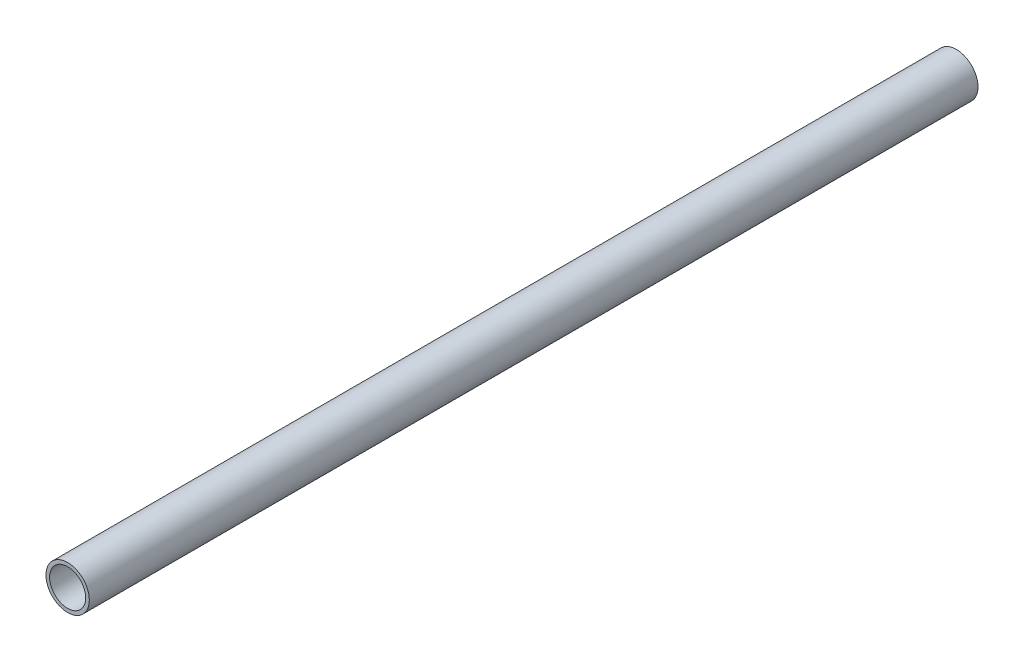
ISO-10303-21;
HEADER;
FILE_DESCRIPTION(('STEP AP214'),'2;1');
FILE_NAME('part.step','',(''),(''),'','','');
FILE_SCHEMA(('AUTOMOTIVE_DESIGN { 1 0 10303 214 1 1 1 1 }'));
ENDSEC;
DATA;
#1=APPLICATION_CONTEXT('core data for automotive mechanical design processes');
#2=APPLICATION_PROTOCOL_DEFINITION('international standard','automotive_design',2000,#1);
#3=PRODUCT_CONTEXT('',#1,'mechanical');
#4=PRODUCT('Part','Part','',(#3));
#5=PRODUCT_RELATED_PRODUCT_CATEGORY('part','',(#4));
#6=PRODUCT_DEFINITION_FORMATION('','',#4);
#7=PRODUCT_DEFINITION_CONTEXT('part definition',#1,'design');
#8=PRODUCT_DEFINITION('design','',#6,#7);
#9=PRODUCT_DEFINITION_SHAPE('','',#8);
#10=(LENGTH_UNIT() NAMED_UNIT(*) SI_UNIT(.MILLI.,.METRE.));
#11=(NAMED_UNIT(*) PLANE_ANGLE_UNIT() SI_UNIT($,.RADIAN.));
#12=(NAMED_UNIT(*) SI_UNIT($,.STERADIAN.) SOLID_ANGLE_UNIT());
#13=UNCERTAINTY_MEASURE_WITH_UNIT(LENGTH_MEASURE(1.E-05),#10,'distance_accuracy_value','');
#14=(GEOMETRIC_REPRESENTATION_CONTEXT(3) GLOBAL_UNCERTAINTY_ASSIGNED_CONTEXT((#13)) GLOBAL_UNIT_ASSIGNED_CONTEXT((#10,
#11,#12)) REPRESENTATION_CONTEXT('',''));
#15=CARTESIAN_POINT('',(0.,0.,0.));
#16=DIRECTION('',(0.,0.,1.));
#17=DIRECTION('',(1.,0.,0.));
#18=AXIS2_PLACEMENT_3D('',#15,#16,#17);
#19=CARTESIAN_POINT('',(0.,0.,246.));
#20=DIRECTION('',(0.,0.,1.));
#21=DIRECTION('',(1.,0.,0.));
#22=AXIS2_PLACEMENT_3D('',#19,#20,#21);
#23=PLANE('',#22);
#24=CARTESIAN_POINT('',(0.,0.,246.));
#25=DIRECTION('',(0.,0.,1.));
#26=DIRECTION('',(1.,0.,0.));
#27=AXIS2_PLACEMENT_3D('',#24,#25,#26);
#28=CIRCLE('',#27,6.);
#29=CARTESIAN_POINT('',(6.,0.,246.));
#30=VERTEX_POINT('',#29);
#31=EDGE_CURVE('E10',#30,#30,#28,.T.);
#32=ORIENTED_EDGE('',*,*,#31,.T.);
#33=EDGE_LOOP('',(#32));
#34=FACE_BOUND('',#33,.T.);
#35=CARTESIAN_POINT('',(0.,0.,246.));
#36=DIRECTION('',(0.,0.,1.));
#37=DIRECTION('',(1.,0.,0.));
#38=AXIS2_PLACEMENT_3D('',#35,#36,#37);
#39=CIRCLE('',#38,5.);
#40=CARTESIAN_POINT('',(5.,0.,246.));
#41=VERTEX_POINT('',#40);
#42=EDGE_CURVE('E42',#41,#41,#39,.T.);
#43=ORIENTED_EDGE('',*,*,#42,.F.);
#44=EDGE_LOOP('',(#43));
#45=FACE_BOUND('',#44,.T.);
#46=ADVANCED_FACE('F31',(#34,#45),#23,.T.);
#47=CARTESIAN_POINT('',(0.,0.,0.));
#48=DIRECTION('',(0.,0.,1.));
#49=DIRECTION('',(1.,0.,0.));
#50=AXIS2_PLACEMENT_3D('',#47,#48,#49);
#51=PLANE('',#50);
#52=CARTESIAN_POINT('',(0.,0.,0.));
#53=DIRECTION('',(0.,0.,1.));
#54=DIRECTION('',(1.,0.,0.));
#55=AXIS2_PLACEMENT_3D('',#52,#53,#54);
#56=CIRCLE('',#55,6.);
#57=CARTESIAN_POINT('',(6.,0.,0.));
#58=VERTEX_POINT('',#57);
#59=EDGE_CURVE('E35',#58,#58,#56,.T.);
#60=ORIENTED_EDGE('',*,*,#59,.F.);
#61=EDGE_LOOP('',(#60));
#62=FACE_BOUND('',#61,.T.);
#63=CARTESIAN_POINT('',(0.,0.,0.));
#64=DIRECTION('',(0.,0.,1.));
#65=DIRECTION('',(1.,0.,0.));
#66=AXIS2_PLACEMENT_3D('',#63,#64,#65);
#67=CIRCLE('',#66,5.);
#68=CARTESIAN_POINT('',(5.,0.,0.));
#69=VERTEX_POINT('',#68);
#70=EDGE_CURVE('E44',#69,#69,#67,.T.);
#71=ORIENTED_EDGE('',*,*,#70,.T.);
#72=EDGE_LOOP('',(#71));
#73=FACE_BOUND('',#72,.T.);
#74=ADVANCED_FACE('F54',(#62,#73),#51,.F.);
#75=CARTESIAN_POINT('',(0.,0.,246.));
#76=DIRECTION('',(0.,0.,-1.));
#77=DIRECTION('',(-1.,0.,0.));
#78=AXIS2_PLACEMENT_3D('',#75,#76,#77);
#79=CYLINDRICAL_SURFACE('',#78,6.);
#80=ORIENTED_EDGE('',*,*,#31,.F.);
#81=EDGE_LOOP('',(#80));
#82=FACE_BOUND('',#81,.T.);
#83=ORIENTED_EDGE('',*,*,#59,.T.);
#84=EDGE_LOOP('',(#83));
#85=FACE_BOUND('',#84,.T.);
#86=ADVANCED_FACE('F33',(#82,#85),#79,.T.);
#87=CARTESIAN_POINT('',(0.,0.,246.));
#88=DIRECTION('',(0.,0.,-1.));
#89=DIRECTION('',(-1.,0.,0.));
#90=AXIS2_PLACEMENT_3D('',#87,#88,#89);
#91=CYLINDRICAL_SURFACE('',#90,5.);
#92=ORIENTED_EDGE('',*,*,#42,.T.);
#93=EDGE_LOOP('',(#92));
#94=FACE_BOUND('',#93,.T.);
#95=ORIENTED_EDGE('',*,*,#70,.F.);
#96=EDGE_LOOP('',(#95));
#97=FACE_BOUND('',#96,.T.);
#98=ADVANCED_FACE('F50',(#94,#97),#91,.F.);
#99=CLOSED_SHELL('',(#46,#74,#86,#98));
#100=MANIFOLD_SOLID_BREP('B2',#99);
#101=ADVANCED_BREP_SHAPE_REPRESENTATION('',(#18,#100),#14);
#102=SHAPE_DEFINITION_REPRESENTATION(#9,#101);
ENDSEC;
END-ISO-10303-21;
